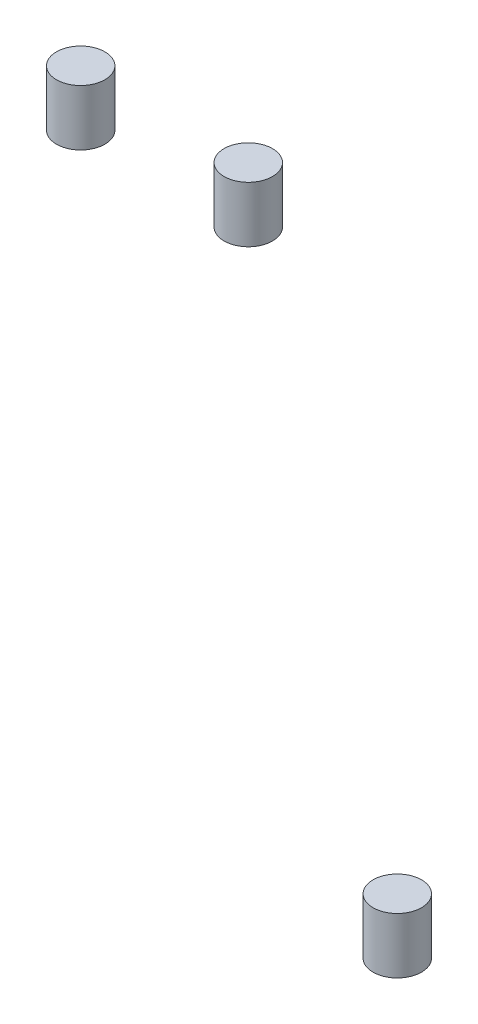
ISO-10303-21;
HEADER;
FILE_DESCRIPTION(('STEP AP214'),'2;1');
FILE_NAME('part.step','',(''),(''),'','','');
FILE_SCHEMA(('AUTOMOTIVE_DESIGN { 1 0 10303 214 1 1 1 1 }'));
ENDSEC;
DATA;
#1=APPLICATION_CONTEXT('core data for automotive mechanical design processes');
#2=APPLICATION_PROTOCOL_DEFINITION('international standard','automotive_design',2000,#1);
#3=PRODUCT_CONTEXT('',#1,'mechanical');
#4=PRODUCT('Part','Part','',(#3));
#5=PRODUCT_RELATED_PRODUCT_CATEGORY('part','',(#4));
#6=PRODUCT_DEFINITION_FORMATION('','',#4);
#7=PRODUCT_DEFINITION_CONTEXT('part definition',#1,'design');
#8=PRODUCT_DEFINITION('design','',#6,#7);
#9=PRODUCT_DEFINITION_SHAPE('','',#8);
#10=(LENGTH_UNIT() NAMED_UNIT(*) SI_UNIT(.MILLI.,.METRE.));
#11=(NAMED_UNIT(*) PLANE_ANGLE_UNIT() SI_UNIT($,.RADIAN.));
#12=(NAMED_UNIT(*) SI_UNIT($,.STERADIAN.) SOLID_ANGLE_UNIT());
#13=UNCERTAINTY_MEASURE_WITH_UNIT(LENGTH_MEASURE(1.E-05),#10,'distance_accuracy_value','');
#14=(GEOMETRIC_REPRESENTATION_CONTEXT(3) GLOBAL_UNCERTAINTY_ASSIGNED_CONTEXT((#13)) GLOBAL_UNIT_ASSIGNED_CONTEXT((#10,
#11,#12)) REPRESENTATION_CONTEXT('',''));
#15=CARTESIAN_POINT('',(0.,0.,0.));
#16=DIRECTION('',(0.,0.,1.));
#17=DIRECTION('',(1.,0.,0.));
#18=AXIS2_PLACEMENT_3D('',#15,#16,#17);
#19=CARTESIAN_POINT('',(450.,-1750.,-400.));
#20=DIRECTION('',(0.,-1.,0.));
#21=DIRECTION('',(0.,0.,-1.));
#22=AXIS2_PLACEMENT_3D('',#19,#20,#21);
#23=CYLINDRICAL_SURFACE('',#22,130.);
#24=CARTESIAN_POINT('',(450.,-1750.,-400.));
#25=DIRECTION('',(0.,1.,0.));
#26=DIRECTION('',(0.,0.,1.));
#27=AXIS2_PLACEMENT_3D('',#24,#25,#26);
#28=CIRCLE('',#27,130.);
#29=CARTESIAN_POINT('',(450.,-1750.,-270.));
#30=VERTEX_POINT('',#29);
#31=EDGE_CURVE('E11',#30,#30,#28,.T.);
#32=ORIENTED_EDGE('',*,*,#31,.F.);
#33=EDGE_LOOP('',(#32));
#34=FACE_BOUND('',#33,.T.);
#35=CARTESIAN_POINT('',(450.,-2050.,-400.));
#36=DIRECTION('',(0.,1.,0.));
#37=DIRECTION('',(0.,0.,1.));
#38=AXIS2_PLACEMENT_3D('',#35,#36,#37);
#39=CIRCLE('',#38,130.);
#40=CARTESIAN_POINT('',(450.,-2050.,-270.));
#41=VERTEX_POINT('',#40);
#42=EDGE_CURVE('E47',#41,#41,#39,.T.);
#43=ORIENTED_EDGE('',*,*,#42,.T.);
#44=EDGE_LOOP('',(#43));
#45=FACE_BOUND('',#44,.T.);
#46=ADVANCED_FACE('F46',(#34,#45),#23,.T.);
#47=CARTESIAN_POINT('',(450.,-1750.,-400.));
#48=DIRECTION('',(0.,1.,0.));
#49=DIRECTION('',(0.,0.,1.));
#50=AXIS2_PLACEMENT_3D('',#47,#48,#49);
#51=PLANE('',#50);
#52=ORIENTED_EDGE('',*,*,#31,.T.);
#53=EDGE_LOOP('',(#52));
#54=FACE_BOUND('',#53,.T.);
#55=ADVANCED_FACE('F61',(#54),#51,.T.);
#56=CARTESIAN_POINT('',(450.,-2050.,-400.));
#57=DIRECTION('',(0.,1.,0.));
#58=DIRECTION('',(0.,0.,1.));
#59=AXIS2_PLACEMENT_3D('',#56,#57,#58);
#60=PLANE('',#59);
#61=ORIENTED_EDGE('',*,*,#42,.F.);
#62=EDGE_LOOP('',(#61));
#63=FACE_BOUND('',#62,.T.);
#64=ADVANCED_FACE('F56',(#63),#60,.F.);
#65=CLOSED_SHELL('',(#46,#55,#64));
#66=MANIFOLD_SOLID_BREP('B2',#65);
#67=CARTESIAN_POINT('',(-450.,2050.,400.));
#68=DIRECTION('',(0.,-1.,0.));
#69=DIRECTION('',(0.,0.,-1.));
#70=AXIS2_PLACEMENT_3D('',#67,#68,#69);
#71=CYLINDRICAL_SURFACE('',#70,130.);
#72=CARTESIAN_POINT('',(-450.,2050.,400.));
#73=DIRECTION('',(0.,1.,0.));
#74=DIRECTION('',(0.,0.,1.));
#75=AXIS2_PLACEMENT_3D('',#72,#73,#74);
#76=CIRCLE('',#75,130.);
#77=CARTESIAN_POINT('',(-450.,2050.,530.));
#78=VERTEX_POINT('',#77);
#79=EDGE_CURVE('E44',#78,#78,#76,.T.);
#80=ORIENTED_EDGE('',*,*,#79,.F.);
#81=EDGE_LOOP('',(#80));
#82=FACE_BOUND('',#81,.T.);
#83=CARTESIAN_POINT('',(-450.,1750.,400.));
#84=DIRECTION('',(0.,1.,0.));
#85=DIRECTION('',(0.,0.,1.));
#86=AXIS2_PLACEMENT_3D('',#83,#84,#85);
#87=CIRCLE('',#86,130.);
#88=CARTESIAN_POINT('',(-450.,1750.,530.));
#89=VERTEX_POINT('',#88);
#90=EDGE_CURVE('E100',#89,#89,#87,.T.);
#91=ORIENTED_EDGE('',*,*,#90,.T.);
#92=EDGE_LOOP('',(#91));
#93=FACE_BOUND('',#92,.T.);
#94=ADVANCED_FACE('F94',(#82,#93),#71,.T.);
#95=CARTESIAN_POINT('',(-450.,2050.,400.));
#96=DIRECTION('',(0.,1.,0.));
#97=DIRECTION('',(0.,0.,1.));
#98=AXIS2_PLACEMENT_3D('',#95,#96,#97);
#99=PLANE('',#98);
#100=ORIENTED_EDGE('',*,*,#79,.T.);
#101=EDGE_LOOP('',(#100));
#102=FACE_BOUND('',#101,.T.);
#103=ADVANCED_FACE('F108',(#102),#99,.T.);
#104=CARTESIAN_POINT('',(-450.,1750.,400.));
#105=DIRECTION('',(0.,1.,0.));
#106=DIRECTION('',(0.,0.,1.));
#107=AXIS2_PLACEMENT_3D('',#104,#105,#106);
#108=PLANE('',#107);
#109=ORIENTED_EDGE('',*,*,#90,.F.);
#110=EDGE_LOOP('',(#109));
#111=FACE_BOUND('',#110,.T.);
#112=ADVANCED_FACE('F110',(#111),#108,.F.);
#113=CLOSED_SHELL('',(#94,#103,#112));
#114=MANIFOLD_SOLID_BREP('B6',#113);
#115=CARTESIAN_POINT('',(450.,2050.,400.));
#116=DIRECTION('',(0.,-1.,0.));
#117=DIRECTION('',(0.,0.,-1.));
#118=AXIS2_PLACEMENT_3D('',#115,#116,#117);
#119=CYLINDRICAL_SURFACE('',#118,130.);
#120=CARTESIAN_POINT('',(450.,2050.,400.));
#121=DIRECTION('',(0.,1.,0.));
#122=DIRECTION('',(0.,0.,1.));
#123=AXIS2_PLACEMENT_3D('',#120,#121,#122);
#124=CIRCLE('',#123,130.);
#125=CARTESIAN_POINT('',(450.,2050.,530.));
#126=VERTEX_POINT('',#125);
#127=EDGE_CURVE('E91',#126,#126,#124,.T.);
#128=ORIENTED_EDGE('',*,*,#127,.F.);
#129=EDGE_LOOP('',(#128));
#130=FACE_BOUND('',#129,.T.);
#131=CARTESIAN_POINT('',(450.,1750.,400.));
#132=DIRECTION('',(0.,1.,0.));
#133=DIRECTION('',(0.,0.,1.));
#134=AXIS2_PLACEMENT_3D('',#131,#132,#133);
#135=CIRCLE('',#134,130.);
#136=CARTESIAN_POINT('',(450.,1750.,530.));
#137=VERTEX_POINT('',#136);
#138=EDGE_CURVE('E139',#137,#137,#135,.T.);
#139=ORIENTED_EDGE('',*,*,#138,.T.);
#140=EDGE_LOOP('',(#139));
#141=FACE_BOUND('',#140,.T.);
#142=ADVANCED_FACE('F134',(#130,#141),#119,.T.);
#143=CARTESIAN_POINT('',(450.,2050.,400.));
#144=DIRECTION('',(0.,1.,0.));
#145=DIRECTION('',(0.,0.,1.));
#146=AXIS2_PLACEMENT_3D('',#143,#144,#145);
#147=PLANE('',#146);
#148=ORIENTED_EDGE('',*,*,#127,.T.);
#149=EDGE_LOOP('',(#148));
#150=FACE_BOUND('',#149,.T.);
#151=ADVANCED_FACE('F147',(#150),#147,.T.);
#152=CARTESIAN_POINT('',(450.,1750.,400.));
#153=DIRECTION('',(0.,1.,0.));
#154=DIRECTION('',(0.,0.,1.));
#155=AXIS2_PLACEMENT_3D('',#152,#153,#154);
#156=PLANE('',#155);
#157=ORIENTED_EDGE('',*,*,#138,.F.);
#158=EDGE_LOOP('',(#157));
#159=FACE_BOUND('',#158,.T.);
#160=ADVANCED_FACE('F146',(#159),#156,.F.);
#161=CLOSED_SHELL('',(#142,#151,#160));
#162=MANIFOLD_SOLID_BREP('B37',#161);
#163=ADVANCED_BREP_SHAPE_REPRESENTATION('',(#18,#66,#114,#162),#14);
#164=SHAPE_DEFINITION_REPRESENTATION(#9,#163);
ENDSEC;
END-ISO-10303-21;
